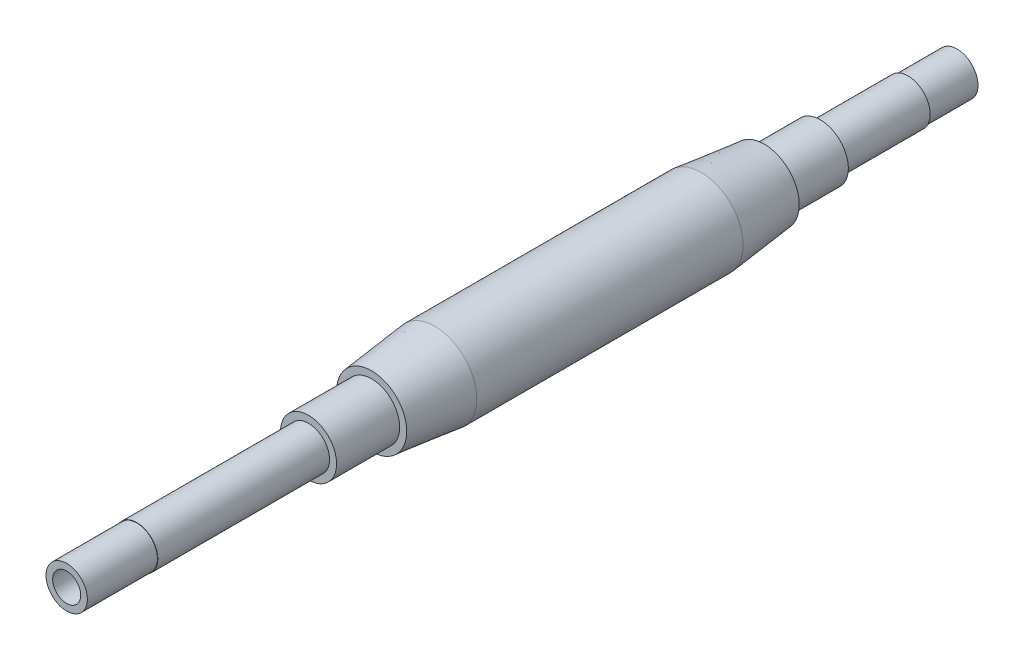
ISO-10303-21;
HEADER;
FILE_DESCRIPTION(('STEP AP214'),'2;1');
FILE_NAME('part.step','',(''),(''),'','','');
FILE_SCHEMA(('AUTOMOTIVE_DESIGN { 1 0 10303 214 1 1 1 1 }'));
ENDSEC;
DATA;
#1=APPLICATION_CONTEXT('core data for automotive mechanical design processes');
#2=APPLICATION_PROTOCOL_DEFINITION('international standard','automotive_design',2000,#1);
#3=PRODUCT_CONTEXT('',#1,'mechanical');
#4=PRODUCT('Part','Part','',(#3));
#5=PRODUCT_RELATED_PRODUCT_CATEGORY('part','',(#4));
#6=PRODUCT_DEFINITION_FORMATION('','',#4);
#7=PRODUCT_DEFINITION_CONTEXT('part definition',#1,'design');
#8=PRODUCT_DEFINITION('design','',#6,#7);
#9=PRODUCT_DEFINITION_SHAPE('','',#8);
#10=(LENGTH_UNIT() NAMED_UNIT(*) SI_UNIT(.MILLI.,.METRE.));
#11=(NAMED_UNIT(*) PLANE_ANGLE_UNIT() SI_UNIT($,.RADIAN.));
#12=(NAMED_UNIT(*) SI_UNIT($,.STERADIAN.) SOLID_ANGLE_UNIT());
#13=UNCERTAINTY_MEASURE_WITH_UNIT(LENGTH_MEASURE(1.E-05),#10,'distance_accuracy_value','');
#14=(GEOMETRIC_REPRESENTATION_CONTEXT(3) GLOBAL_UNCERTAINTY_ASSIGNED_CONTEXT((#13)) GLOBAL_UNIT_ASSIGNED_CONTEXT((#10,
#11,#12)) REPRESENTATION_CONTEXT('',''));
#15=CARTESIAN_POINT('',(0.,0.,0.));
#16=DIRECTION('',(0.,0.,1.));
#17=DIRECTION('',(1.,0.,0.));
#18=AXIS2_PLACEMENT_3D('',#15,#16,#17);
#19=CARTESIAN_POINT('',(0.,0.,0.));
#20=DIRECTION('',(0.,0.,-1.));
#21=DIRECTION('',(-1.,0.,0.));
#22=AXIS2_PLACEMENT_3D('',#19,#20,#21);
#23=PLANE('',#22);
#24=CARTESIAN_POINT('',(0.,0.,0.));
#25=DIRECTION('',(0.,0.,-1.));
#26=DIRECTION('',(-1.,0.,0.));
#27=AXIS2_PLACEMENT_3D('',#24,#25,#26);
#28=CIRCLE('',#27,1.99999999999999);
#29=CARTESIAN_POINT('',(-1.99999999999999,0.,0.));
#30=VERTEX_POINT('',#29);
#31=EDGE_CURVE('E92',#30,#30,#28,.T.);
#32=ORIENTED_EDGE('',*,*,#31,.F.);
#33=EDGE_LOOP('',(#32));
#34=FACE_BOUND('',#33,.T.);
#35=CARTESIAN_POINT('',(0.,0.,0.));
#36=DIRECTION('',(0.,0.,-1.));
#37=DIRECTION('',(-1.,0.,0.));
#38=AXIS2_PLACEMENT_3D('',#35,#36,#37);
#39=CIRCLE('',#38,3.);
#40=CARTESIAN_POINT('',(-3.,0.,0.));
#41=VERTEX_POINT('',#40);
#42=EDGE_CURVE('E10',#41,#41,#39,.T.);
#43=ORIENTED_EDGE('',*,*,#42,.T.);
#44=EDGE_LOOP('',(#43));
#45=FACE_BOUND('',#44,.T.);
#46=ADVANCED_FACE('F34',(#34,#45),#23,.T.);
#47=CARTESIAN_POINT('',(0.,0.,0.));
#48=DIRECTION('',(0.,0.,-1.));
#49=DIRECTION('',(-1.,0.,0.));
#50=AXIS2_PLACEMENT_3D('',#47,#48,#49);
#51=CYLINDRICAL_SURFACE('',#50,3.);
#52=CARTESIAN_POINT('',(0.,0.,7.));
#53=DIRECTION('',(0.,0.,-1.));
#54=DIRECTION('',(-1.,0.,0.));
#55=AXIS2_PLACEMENT_3D('',#52,#53,#54);
#56=CIRCLE('',#55,3.);
#57=CARTESIAN_POINT('',(-3.,0.,7.));
#58=VERTEX_POINT('',#57);
#59=EDGE_CURVE('E40',#58,#58,#56,.T.);
#60=ORIENTED_EDGE('',*,*,#59,.T.);
#61=EDGE_LOOP('',(#60));
#62=FACE_BOUND('',#61,.T.);
#63=ORIENTED_EDGE('',*,*,#42,.F.);
#64=EDGE_LOOP('',(#63));
#65=FACE_BOUND('',#64,.T.);
#66=ADVANCED_FACE('F99',(#62,#65),#51,.T.);
#67=CARTESIAN_POINT('',(0.,3.,7.));
#68=DIRECTION('',(0.,0.,-1.));
#69=DIRECTION('',(-1.,0.,0.));
#70=AXIS2_PLACEMENT_3D('',#67,#68,#69);
#71=PLANE('',#70);
#72=CARTESIAN_POINT('',(0.,0.,7.));
#73=DIRECTION('',(0.,0.,-1.));
#74=DIRECTION('',(-1.,0.,0.));
#75=AXIS2_PLACEMENT_3D('',#72,#73,#74);
#76=CIRCLE('',#75,3.175);
#77=CARTESIAN_POINT('',(-3.175,0.,7.));
#78=VERTEX_POINT('',#77);
#79=EDGE_CURVE('E44',#78,#78,#76,.T.);
#80=ORIENTED_EDGE('',*,*,#79,.T.);
#81=EDGE_LOOP('',(#80));
#82=FACE_BOUND('',#81,.T.);
#83=ORIENTED_EDGE('',*,*,#59,.F.);
#84=EDGE_LOOP('',(#83));
#85=FACE_BOUND('',#84,.T.);
#86=ADVANCED_FACE('F103',(#82,#85),#71,.T.);
#87=CARTESIAN_POINT('',(0.,0.,0.));
#88=DIRECTION('',(0.,0.,-1.));
#89=DIRECTION('',(-1.,0.,0.));
#90=AXIS2_PLACEMENT_3D('',#87,#88,#89);
#91=CYLINDRICAL_SURFACE('',#90,3.175);
#92=CARTESIAN_POINT('',(0.,0.,19.5));
#93=DIRECTION('',(0.,0.,-1.));
#94=DIRECTION('',(-1.,0.,0.));
#95=AXIS2_PLACEMENT_3D('',#92,#93,#94);
#96=CIRCLE('',#95,3.175);
#97=CARTESIAN_POINT('',(-3.175,0.,19.5));
#98=VERTEX_POINT('',#97);
#99=EDGE_CURVE('E48',#98,#98,#96,.T.);
#100=ORIENTED_EDGE('',*,*,#99,.T.);
#101=EDGE_LOOP('',(#100));
#102=FACE_BOUND('',#101,.T.);
#103=ORIENTED_EDGE('',*,*,#79,.F.);
#104=EDGE_LOOP('',(#103));
#105=FACE_BOUND('',#104,.T.);
#106=ADVANCED_FACE('F107',(#102,#105),#91,.T.);
#107=CARTESIAN_POINT('',(0.,3.175,19.5));
#108=DIRECTION('',(0.,0.,-1.));
#109=DIRECTION('',(-1.,0.,0.));
#110=AXIS2_PLACEMENT_3D('',#107,#108,#109);
#111=PLANE('',#110);
#112=CARTESIAN_POINT('',(0.,0.,19.5));
#113=DIRECTION('',(0.,0.,-1.));
#114=DIRECTION('',(-1.,0.,0.));
#115=AXIS2_PLACEMENT_3D('',#112,#113,#114);
#116=CIRCLE('',#115,4.);
#117=CARTESIAN_POINT('',(-4.,0.,19.5));
#118=VERTEX_POINT('',#117);
#119=EDGE_CURVE('E53',#118,#118,#116,.T.);
#120=ORIENTED_EDGE('',*,*,#119,.T.);
#121=EDGE_LOOP('',(#120));
#122=FACE_BOUND('',#121,.T.);
#123=ORIENTED_EDGE('',*,*,#99,.F.);
#124=EDGE_LOOP('',(#123));
#125=FACE_BOUND('',#124,.T.);
#126=ADVANCED_FACE('F114',(#122,#125),#111,.T.);
#127=CARTESIAN_POINT('',(0.,0.,0.));
#128=DIRECTION('',(0.,0.,-1.));
#129=DIRECTION('',(-1.,0.,0.));
#130=AXIS2_PLACEMENT_3D('',#127,#128,#129);
#131=CYLINDRICAL_SURFACE('',#130,4.);
#132=CARTESIAN_POINT('',(0.,0.,27.5));
#133=DIRECTION('',(0.,0.,-1.));
#134=DIRECTION('',(-1.,0.,0.));
#135=AXIS2_PLACEMENT_3D('',#132,#133,#134);
#136=CIRCLE('',#135,4.);
#137=CARTESIAN_POINT('',(-4.,0.,27.5));
#138=VERTEX_POINT('',#137);
#139=EDGE_CURVE('E56',#138,#138,#136,.T.);
#140=ORIENTED_EDGE('',*,*,#139,.T.);
#141=EDGE_LOOP('',(#140));
#142=FACE_BOUND('',#141,.T.);
#143=ORIENTED_EDGE('',*,*,#119,.F.);
#144=EDGE_LOOP('',(#143));
#145=FACE_BOUND('',#144,.T.);
#146=ADVANCED_FACE('F118',(#142,#145),#131,.T.);
#147=CARTESIAN_POINT('',(0.,4.,27.5));
#148=DIRECTION('',(0.,0.,-1.));
#149=DIRECTION('',(-1.,0.,0.));
#150=AXIS2_PLACEMENT_3D('',#147,#148,#149);
#151=PLANE('',#150);
#152=CARTESIAN_POINT('',(0.,0.,27.5));
#153=DIRECTION('',(0.,0.,-1.));
#154=DIRECTION('',(-1.,0.,0.));
#155=AXIS2_PLACEMENT_3D('',#152,#153,#154);
#156=CIRCLE('',#155,4.99999999999999);
#157=CARTESIAN_POINT('',(-4.99999999999999,0.,27.5));
#158=VERTEX_POINT('',#157);
#159=EDGE_CURVE('E59',#158,#158,#156,.T.);
#160=ORIENTED_EDGE('',*,*,#159,.T.);
#161=EDGE_LOOP('',(#160));
#162=FACE_BOUND('',#161,.T.);
#163=ORIENTED_EDGE('',*,*,#139,.F.);
#164=EDGE_LOOP('',(#163));
#165=FACE_BOUND('',#164,.T.);
#166=ADVANCED_FACE('F122',(#162,#165),#151,.T.);
#167=CARTESIAN_POINT('',(0.,0.,27.5));
#168=DIRECTION('',(0.,0.,1.));
#169=DIRECTION('',(1.,0.,0.));
#170=AXIS2_PLACEMENT_3D('',#167,#168,#169);
#171=CONICAL_SURFACE('',#170,4.99999999999999,0.110657221173896);
#172=CARTESIAN_POINT('',(0.,0.,36.5));
#173=DIRECTION('',(0.,0.,-1.));
#174=DIRECTION('',(-1.,0.,0.));
#175=AXIS2_PLACEMENT_3D('',#172,#173,#174);
#176=CIRCLE('',#175,6.);
#177=CARTESIAN_POINT('',(-6.,0.,36.5));
#178=VERTEX_POINT('',#177);
#179=EDGE_CURVE('E62',#178,#178,#176,.T.);
#180=ORIENTED_EDGE('',*,*,#179,.T.);
#181=EDGE_LOOP('',(#180));
#182=FACE_BOUND('',#181,.T.);
#183=ORIENTED_EDGE('',*,*,#159,.F.);
#184=EDGE_LOOP('',(#183));
#185=FACE_BOUND('',#184,.T.);
#186=ADVANCED_FACE('F126',(#182,#185),#171,.T.);
#187=CARTESIAN_POINT('',(0.,0.,0.));
#188=DIRECTION('',(0.,0.,-1.));
#189=DIRECTION('',(-1.,0.,0.));
#190=AXIS2_PLACEMENT_3D('',#187,#188,#189);
#191=CYLINDRICAL_SURFACE('',#190,5.99999999999999);
#192=CARTESIAN_POINT('',(0.,0.,74.5));
#193=DIRECTION('',(0.,0.,-1.));
#194=DIRECTION('',(-1.,0.,0.));
#195=AXIS2_PLACEMENT_3D('',#192,#193,#194);
#196=CIRCLE('',#195,5.99999999999999);
#197=CARTESIAN_POINT('',(-5.99999999999999,0.,74.5));
#198=VERTEX_POINT('',#197);
#199=EDGE_CURVE('E65',#198,#198,#196,.T.);
#200=ORIENTED_EDGE('',*,*,#199,.T.);
#201=EDGE_LOOP('',(#200));
#202=FACE_BOUND('',#201,.T.);
#203=ORIENTED_EDGE('',*,*,#179,.F.);
#204=EDGE_LOOP('',(#203));
#205=FACE_BOUND('',#204,.T.);
#206=ADVANCED_FACE('F130',(#202,#205),#191,.T.);
#207=CARTESIAN_POINT('',(0.,0.,74.5));
#208=DIRECTION('',(0.,0.,-1.));
#209=DIRECTION('',(-1.,0.,0.));
#210=AXIS2_PLACEMENT_3D('',#207,#208,#209);
#211=CONICAL_SURFACE('',#210,5.99999999999999,0.110657221173896);
#212=CARTESIAN_POINT('',(0.,0.,83.5));
#213=DIRECTION('',(0.,0.,-1.));
#214=DIRECTION('',(-1.,0.,0.));
#215=AXIS2_PLACEMENT_3D('',#212,#213,#214);
#216=CIRCLE('',#215,4.99999999999999);
#217=CARTESIAN_POINT('',(-4.99999999999999,0.,83.5));
#218=VERTEX_POINT('',#217);
#219=EDGE_CURVE('E68',#218,#218,#216,.T.);
#220=ORIENTED_EDGE('',*,*,#219,.T.);
#221=EDGE_LOOP('',(#220));
#222=FACE_BOUND('',#221,.T.);
#223=ORIENTED_EDGE('',*,*,#199,.F.);
#224=EDGE_LOOP('',(#223));
#225=FACE_BOUND('',#224,.T.);
#226=ADVANCED_FACE('F134',(#222,#225),#211,.T.);
#227=CARTESIAN_POINT('',(0.,4.99999999999999,83.5));
#228=DIRECTION('',(0.,0.,1.));
#229=DIRECTION('',(1.,0.,0.));
#230=AXIS2_PLACEMENT_3D('',#227,#228,#229);
#231=PLANE('',#230);
#232=CARTESIAN_POINT('',(0.,0.,83.5));
#233=DIRECTION('',(0.,0.,-1.));
#234=DIRECTION('',(-1.,0.,0.));
#235=AXIS2_PLACEMENT_3D('',#232,#233,#234);
#236=CIRCLE('',#235,3.99999999999999);
#237=CARTESIAN_POINT('',(-3.99999999999999,0.,83.5));
#238=VERTEX_POINT('',#237);
#239=EDGE_CURVE('E71',#238,#238,#236,.T.);
#240=ORIENTED_EDGE('',*,*,#239,.T.);
#241=EDGE_LOOP('',(#240));
#242=FACE_BOUND('',#241,.T.);
#243=ORIENTED_EDGE('',*,*,#219,.F.);
#244=EDGE_LOOP('',(#243));
#245=FACE_BOUND('',#244,.T.);
#246=ADVANCED_FACE('F138',(#242,#245),#231,.T.);
#247=CARTESIAN_POINT('',(0.,0.,0.));
#248=DIRECTION('',(0.,0.,-1.));
#249=DIRECTION('',(-1.,0.,0.));
#250=AXIS2_PLACEMENT_3D('',#247,#248,#249);
#251=CYLINDRICAL_SURFACE('',#250,3.99999999999999);
#252=CARTESIAN_POINT('',(0.,0.,92.5));
#253=DIRECTION('',(0.,0.,-1.));
#254=DIRECTION('',(-1.,0.,0.));
#255=AXIS2_PLACEMENT_3D('',#252,#253,#254);
#256=CIRCLE('',#255,3.99999999999999);
#257=CARTESIAN_POINT('',(-3.99999999999999,0.,92.5));
#258=VERTEX_POINT('',#257);
#259=EDGE_CURVE('E74',#258,#258,#256,.T.);
#260=ORIENTED_EDGE('',*,*,#259,.T.);
#261=EDGE_LOOP('',(#260));
#262=FACE_BOUND('',#261,.T.);
#263=ORIENTED_EDGE('',*,*,#239,.F.);
#264=EDGE_LOOP('',(#263));
#265=FACE_BOUND('',#264,.T.);
#266=ADVANCED_FACE('F142',(#262,#265),#251,.T.);
#267=CARTESIAN_POINT('',(0.,3.99999999999999,92.5));
#268=DIRECTION('',(0.,0.,1.));
#269=DIRECTION('',(1.,0.,0.));
#270=AXIS2_PLACEMENT_3D('',#267,#268,#269);
#271=PLANE('',#270);
#272=CARTESIAN_POINT('',(0.,0.,92.5));
#273=DIRECTION('',(0.,0.,-1.));
#274=DIRECTION('',(-1.,0.,0.));
#275=AXIS2_PLACEMENT_3D('',#272,#273,#274);
#276=CIRCLE('',#275,2.99999999999999);
#277=CARTESIAN_POINT('',(-2.99999999999999,0.,92.5));
#278=VERTEX_POINT('',#277);
#279=EDGE_CURVE('E77',#278,#278,#276,.T.);
#280=ORIENTED_EDGE('',*,*,#279,.T.);
#281=EDGE_LOOP('',(#280));
#282=FACE_BOUND('',#281,.T.);
#283=ORIENTED_EDGE('',*,*,#259,.F.);
#284=EDGE_LOOP('',(#283));
#285=FACE_BOUND('',#284,.T.);
#286=ADVANCED_FACE('F146',(#282,#285),#271,.T.);
#287=CARTESIAN_POINT('',(0.,0.,0.));
#288=DIRECTION('',(0.,0.,-1.));
#289=DIRECTION('',(-1.,0.,0.));
#290=AXIS2_PLACEMENT_3D('',#287,#288,#289);
#291=CYLINDRICAL_SURFACE('',#290,2.99999999999999);
#292=CARTESIAN_POINT('',(0.,0.,117.));
#293=DIRECTION('',(0.,0.,-1.));
#294=DIRECTION('',(-1.,0.,0.));
#295=AXIS2_PLACEMENT_3D('',#292,#293,#294);
#296=CIRCLE('',#295,2.99999999999999);
#297=CARTESIAN_POINT('',(-2.99999999999999,0.,117.));
#298=VERTEX_POINT('',#297);
#299=EDGE_CURVE('E80',#298,#298,#296,.T.);
#300=ORIENTED_EDGE('',*,*,#299,.T.);
#301=EDGE_LOOP('',(#300));
#302=FACE_BOUND('',#301,.T.);
#303=ORIENTED_EDGE('',*,*,#279,.F.);
#304=EDGE_LOOP('',(#303));
#305=FACE_BOUND('',#304,.T.);
#306=ADVANCED_FACE('F150',(#302,#305),#291,.T.);
#307=CARTESIAN_POINT('',(0.,2.94999999999998,117.));
#308=DIRECTION('',(0.,0.,1.));
#309=DIRECTION('',(1.,0.,0.));
#310=AXIS2_PLACEMENT_3D('',#307,#308,#309);
#311=PLANE('',#310);
#312=CARTESIAN_POINT('',(0.,0.,117.));
#313=DIRECTION('',(0.,0.,-1.));
#314=DIRECTION('',(-1.,0.,0.));
#315=AXIS2_PLACEMENT_3D('',#312,#313,#314);
#316=CIRCLE('',#315,2.94999999999998);
#317=CARTESIAN_POINT('',(-2.94999999999998,0.,117.));
#318=VERTEX_POINT('',#317);
#319=EDGE_CURVE('E83',#318,#318,#316,.T.);
#320=ORIENTED_EDGE('',*,*,#319,.T.);
#321=EDGE_LOOP('',(#320));
#322=FACE_BOUND('',#321,.T.);
#323=ORIENTED_EDGE('',*,*,#299,.F.);
#324=EDGE_LOOP('',(#323));
#325=FACE_BOUND('',#324,.T.);
#326=ADVANCED_FACE('F154',(#322,#325),#311,.T.);
#327=CARTESIAN_POINT('',(0.,0.,0.));
#328=DIRECTION('',(0.,0.,-1.));
#329=DIRECTION('',(-1.,0.,0.));
#330=AXIS2_PLACEMENT_3D('',#327,#328,#329);
#331=CYLINDRICAL_SURFACE('',#330,2.94999999999998);
#332=CARTESIAN_POINT('',(0.,0.,127.));
#333=DIRECTION('',(0.,0.,-1.));
#334=DIRECTION('',(-1.,0.,0.));
#335=AXIS2_PLACEMENT_3D('',#332,#333,#334);
#336=CIRCLE('',#335,2.94999999999998);
#337=CARTESIAN_POINT('',(-2.94999999999998,0.,127.));
#338=VERTEX_POINT('',#337);
#339=EDGE_CURVE('E86',#338,#338,#336,.T.);
#340=ORIENTED_EDGE('',*,*,#339,.T.);
#341=EDGE_LOOP('',(#340));
#342=FACE_BOUND('',#341,.T.);
#343=ORIENTED_EDGE('',*,*,#319,.F.);
#344=EDGE_LOOP('',(#343));
#345=FACE_BOUND('',#344,.T.);
#346=ADVANCED_FACE('F158',(#342,#345),#331,.T.);
#347=CARTESIAN_POINT('',(0.,2.94999999999998,127.));
#348=DIRECTION('',(0.,0.,1.));
#349=DIRECTION('',(1.,0.,0.));
#350=AXIS2_PLACEMENT_3D('',#347,#348,#349);
#351=PLANE('',#350);
#352=CARTESIAN_POINT('',(0.,0.,127.));
#353=DIRECTION('',(0.,0.,-1.));
#354=DIRECTION('',(-1.,0.,0.));
#355=AXIS2_PLACEMENT_3D('',#352,#353,#354);
#356=CIRCLE('',#355,1.99999999999998);
#357=CARTESIAN_POINT('',(-1.99999999999998,0.,127.));
#358=VERTEX_POINT('',#357);
#359=EDGE_CURVE('E89',#358,#358,#356,.T.);
#360=ORIENTED_EDGE('',*,*,#359,.T.);
#361=EDGE_LOOP('',(#360));
#362=FACE_BOUND('',#361,.T.);
#363=ORIENTED_EDGE('',*,*,#339,.F.);
#364=EDGE_LOOP('',(#363));
#365=FACE_BOUND('',#364,.T.);
#366=ADVANCED_FACE('F162',(#362,#365),#351,.T.);
#367=CARTESIAN_POINT('',(0.,0.,0.));
#368=DIRECTION('',(0.,0.,-1.));
#369=DIRECTION('',(-1.,0.,0.));
#370=AXIS2_PLACEMENT_3D('',#367,#368,#369);
#371=CYLINDRICAL_SURFACE('',#370,1.99999999999999);
#372=ORIENTED_EDGE('',*,*,#359,.F.);
#373=EDGE_LOOP('',(#372));
#374=FACE_BOUND('',#373,.T.);
#375=ORIENTED_EDGE('',*,*,#31,.T.);
#376=EDGE_LOOP('',(#375));
#377=FACE_BOUND('',#376,.T.);
#378=ADVANCED_FACE('F96',(#374,#377),#371,.F.);
#379=CLOSED_SHELL('',(#46,#66,#86,#106,#126,#146,#166,#186,#206,#226,#246,#266,#286,#306,#326,
#346,#366,#378));
#380=MANIFOLD_SOLID_BREP('B2',#379);
#381=ADVANCED_BREP_SHAPE_REPRESENTATION('',(#18,#380),#14);
#382=SHAPE_DEFINITION_REPRESENTATION(#9,#381);
ENDSEC;
END-ISO-10303-21;
